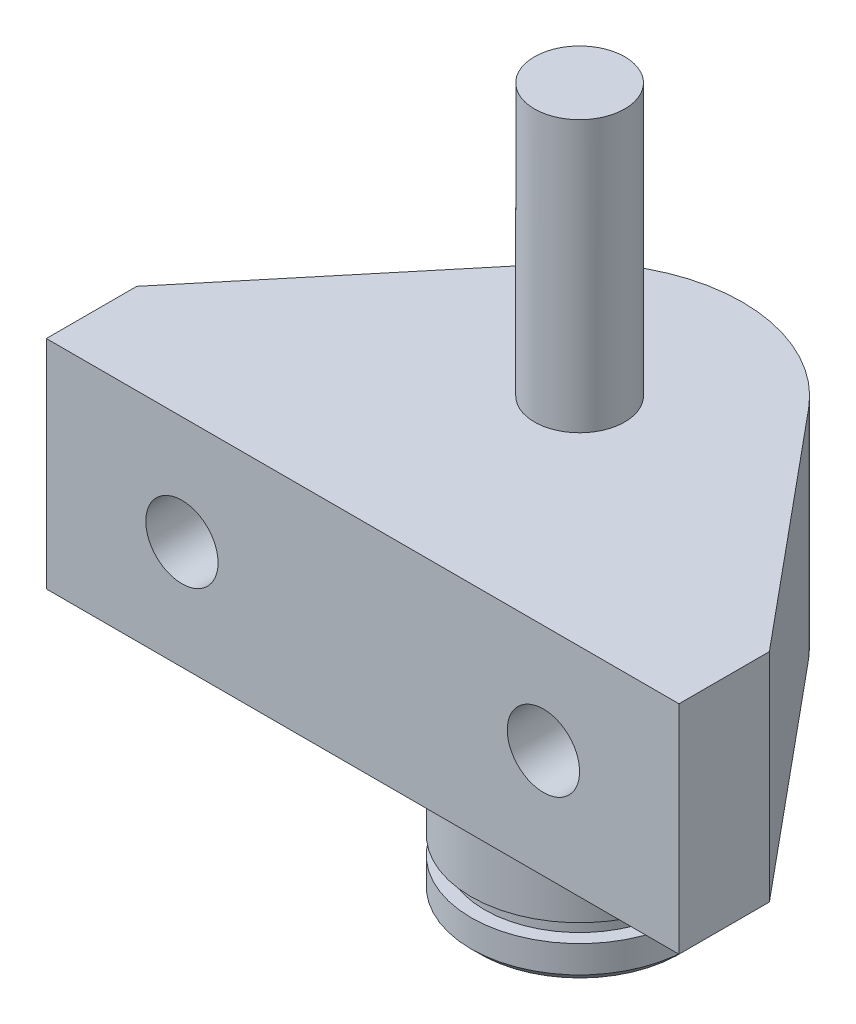
ISO-10303-21;
HEADER;
FILE_DESCRIPTION(('STEP AP214'),'2;1');
FILE_NAME('part.step','',(''),(''),'','','');
FILE_SCHEMA(('AUTOMOTIVE_DESIGN { 1 0 10303 214 1 1 1 1 }'));
ENDSEC;
DATA;
#1=APPLICATION_CONTEXT('core data for automotive mechanical design processes');
#2=APPLICATION_PROTOCOL_DEFINITION('international standard','automotive_design',2000,#1);
#3=PRODUCT_CONTEXT('',#1,'mechanical');
#4=PRODUCT('Part','Part','',(#3));
#5=PRODUCT_RELATED_PRODUCT_CATEGORY('part','',(#4));
#6=PRODUCT_DEFINITION_FORMATION('','',#4);
#7=PRODUCT_DEFINITION_CONTEXT('part definition',#1,'design');
#8=PRODUCT_DEFINITION('design','',#6,#7);
#9=PRODUCT_DEFINITION_SHAPE('','',#8);
#10=(LENGTH_UNIT() NAMED_UNIT(*) SI_UNIT(.MILLI.,.METRE.));
#11=(NAMED_UNIT(*) PLANE_ANGLE_UNIT() SI_UNIT($,.RADIAN.));
#12=(NAMED_UNIT(*) SI_UNIT($,.STERADIAN.) SOLID_ANGLE_UNIT());
#13=UNCERTAINTY_MEASURE_WITH_UNIT(LENGTH_MEASURE(1.E-05),#10,'distance_accuracy_value','');
#14=(GEOMETRIC_REPRESENTATION_CONTEXT(3) GLOBAL_UNCERTAINTY_ASSIGNED_CONTEXT((#13)) GLOBAL_UNIT_ASSIGNED_CONTEXT((#10,
#11,#12)) REPRESENTATION_CONTEXT('',''));
#15=CARTESIAN_POINT('',(0.,0.,0.));
#16=DIRECTION('',(0.,0.,1.));
#17=DIRECTION('',(1.,0.,0.));
#18=AXIS2_PLACEMENT_3D('',#15,#16,#17);
#19=CARTESIAN_POINT('',(-17.5,12.,-6.09769995019883));
#20=DIRECTION('',(1.,0.,0.));
#21=DIRECTION('',(0.,0.,-1.));
#22=AXIS2_PLACEMENT_3D('',#19,#20,#21);
#23=PLANE('',#22);
#24=DIRECTION('',(0.,0.,1.));
#25=VECTOR('',#24,1.);
#26=CARTESIAN_POINT('',(-17.5,0.,-6.09769995019883));
#27=LINE('',#26,#25);
#28=CARTESIAN_POINT('',(-17.5,0.,-6.09769995019883));
#29=VERTEX_POINT('',#28);
#30=CARTESIAN_POINT('',(-17.5,0.,-1.09769995019883));
#31=VERTEX_POINT('',#30);
#32=EDGE_CURVE('E123',#29,#31,#27,.T.);
#33=ORIENTED_EDGE('',*,*,#32,.T.);
#34=DIRECTION('',(0.,-1.,0.));
#35=VECTOR('',#34,1.);
#36=CARTESIAN_POINT('',(-17.5,12.,-1.09769995019883));
#37=LINE('',#36,#35);
#38=CARTESIAN_POINT('',(-17.5,12.,-1.09769995019883));
#39=VERTEX_POINT('',#38);
#40=EDGE_CURVE('E141',#39,#31,#37,.T.);
#41=ORIENTED_EDGE('',*,*,#40,.F.);
#42=DIRECTION('',(0.,0.,1.));
#43=VECTOR('',#42,1.);
#44=CARTESIAN_POINT('',(-17.5,12.,-6.09769995019883));
#45=LINE('',#44,#43);
#46=CARTESIAN_POINT('',(-17.5,12.,-6.09769995019883));
#47=VERTEX_POINT('',#46);
#48=EDGE_CURVE('E134',#47,#39,#45,.T.);
#49=ORIENTED_EDGE('',*,*,#48,.F.);
#50=DIRECTION('',(0.,-1.,0.));
#51=VECTOR('',#50,1.);
#52=CARTESIAN_POINT('',(-17.5,12.,-6.09769995019883));
#53=LINE('',#52,#51);
#54=EDGE_CURVE('E119',#47,#29,#53,.T.);
#55=ORIENTED_EDGE('',*,*,#54,.T.);
#56=EDGE_LOOP('',(#33,#41,#49,#55));
#57=FACE_BOUND('',#56,.T.);
#58=ADVANCED_FACE('F37',(#57),#23,.F.);
#59=CARTESIAN_POINT('',(17.5,12.,-1.09769995019884));
#60=DIRECTION('',(0.,0.,-1.));
#61=DIRECTION('',(-1.,0.,0.));
#62=AXIS2_PLACEMENT_3D('',#59,#60,#61);
#63=PLANE('',#62);
#64=CARTESIAN_POINT('',(10.,6.,-1.09769995019883));
#65=DIRECTION('',(0.,0.,1.));
#66=DIRECTION('',(-1.,0.,0.));
#67=AXIS2_PLACEMENT_3D('',#64,#65,#66);
#68=CIRCLE('',#67,2.);
#69=CARTESIAN_POINT('',(8.,6.,-1.09769995019883));
#70=VERTEX_POINT('',#69);
#71=EDGE_CURVE('E242',#70,#70,#68,.T.);
#72=ORIENTED_EDGE('',*,*,#71,.F.);
#73=EDGE_LOOP('',(#72));
#74=FACE_BOUND('',#73,.T.);
#75=CARTESIAN_POINT('',(-10.,6.,-1.09769995019883));
#76=DIRECTION('',(0.,0.,1.));
#77=DIRECTION('',(1.,0.,0.));
#78=AXIS2_PLACEMENT_3D('',#75,#76,#77);
#79=CIRCLE('',#78,2.);
#80=CARTESIAN_POINT('',(-8.,6.,-1.09769995019883));
#81=VERTEX_POINT('',#80);
#82=EDGE_CURVE('E236',#81,#81,#79,.T.);
#83=ORIENTED_EDGE('',*,*,#82,.F.);
#84=EDGE_LOOP('',(#83));
#85=FACE_BOUND('',#84,.T.);
#86=DIRECTION('',(1.,0.,0.));
#87=VECTOR('',#86,1.);
#88=CARTESIAN_POINT('',(17.5,0.,-1.09769995019884));
#89=LINE('',#88,#87);
#90=CARTESIAN_POINT('',(17.5,0.,-1.09769995019884));
#91=VERTEX_POINT('',#90);
#92=EDGE_CURVE('E126',#31,#91,#89,.T.);
#93=ORIENTED_EDGE('',*,*,#92,.T.);
#94=DIRECTION('',(0.,-1.,0.));
#95=VECTOR('',#94,1.);
#96=CARTESIAN_POINT('',(17.5,12.,-1.09769995019884));
#97=LINE('',#96,#95);
#98=CARTESIAN_POINT('',(17.5,12.,-1.09769995019884));
#99=VERTEX_POINT('',#98);
#100=EDGE_CURVE('E138',#99,#91,#97,.T.);
#101=ORIENTED_EDGE('',*,*,#100,.F.);
#102=DIRECTION('',(1.,0.,0.));
#103=VECTOR('',#102,1.);
#104=CARTESIAN_POINT('',(17.5,12.,-1.09769995019884));
#105=LINE('',#104,#103);
#106=EDGE_CURVE('E92',#39,#99,#105,.T.);
#107=ORIENTED_EDGE('',*,*,#106,.F.);
#108=ORIENTED_EDGE('',*,*,#40,.T.);
#109=EDGE_LOOP('',(#93,#101,#107,#108));
#110=FACE_BOUND('',#109,.T.);
#111=ADVANCED_FACE('F176',(#74,#85,#110),#63,.F.);
#112=CARTESIAN_POINT('',(17.5,12.,-6.09769995019884));
#113=DIRECTION('',(-1.,0.,0.));
#114=DIRECTION('',(0.,0.,1.));
#115=AXIS2_PLACEMENT_3D('',#112,#113,#114);
#116=PLANE('',#115);
#117=DIRECTION('',(0.,0.,-1.));
#118=VECTOR('',#117,1.);
#119=CARTESIAN_POINT('',(17.5,0.,-6.09769995019884));
#120=LINE('',#119,#118);
#121=CARTESIAN_POINT('',(17.5,0.,-6.09769995019884));
#122=VERTEX_POINT('',#121);
#123=EDGE_CURVE('E129',#91,#122,#120,.T.);
#124=ORIENTED_EDGE('',*,*,#123,.T.);
#125=DIRECTION('',(0.,-1.,0.));
#126=VECTOR('',#125,1.);
#127=CARTESIAN_POINT('',(17.5,12.,-6.09769995019884));
#128=LINE('',#127,#126);
#129=CARTESIAN_POINT('',(17.5,12.,-6.09769995019884));
#130=VERTEX_POINT('',#129);
#131=EDGE_CURVE('E114',#130,#122,#128,.T.);
#132=ORIENTED_EDGE('',*,*,#131,.F.);
#133=DIRECTION('',(0.,0.,-1.));
#134=VECTOR('',#133,1.);
#135=CARTESIAN_POINT('',(17.5,12.,-6.09769995019884));
#136=LINE('',#135,#134);
#137=EDGE_CURVE('E105',#99,#130,#136,.T.);
#138=ORIENTED_EDGE('',*,*,#137,.F.);
#139=ORIENTED_EDGE('',*,*,#100,.T.);
#140=EDGE_LOOP('',(#124,#132,#138,#139));
#141=FACE_BOUND('',#140,.T.);
#142=ADVANCED_FACE('F181',(#141),#116,.F.);
#143=CARTESIAN_POINT('',(17.5,12.,-6.09769995019884));
#144=DIRECTION('',(-0.769664929294171,0.,0.638448037521143));
#145=DIRECTION('',(0.638448037521143,0.,0.769664929294171));
#146=AXIS2_PLACEMENT_3D('',#143,#144,#145);
#147=PLANE('',#146);
#148=DIRECTION('',(-0.638448037521143,0.,-0.769664929294171));
#149=VECTOR('',#148,1.);
#150=CARTESIAN_POINT('',(17.5,0.,-6.09769995019884));
#151=LINE('',#150,#149);
#152=CARTESIAN_POINT('',(6.92698436364753,0.,-18.8437322878891));
#153=VERTEX_POINT('',#152);
#154=EDGE_CURVE('E113',#122,#153,#151,.T.);
#155=ORIENTED_EDGE('',*,*,#154,.T.);
#156=DIRECTION('',(0.,-1.,0.));
#157=VECTOR('',#156,1.);
#158=CARTESIAN_POINT('',(6.92698436364753,12.,-18.8437322878891));
#159=LINE('',#158,#157);
#160=CARTESIAN_POINT('',(6.92698436364753,12.,-18.8437322878891));
#161=VERTEX_POINT('',#160);
#162=EDGE_CURVE('E110',#161,#153,#159,.T.);
#163=ORIENTED_EDGE('',*,*,#162,.F.);
#164=DIRECTION('',(-0.638448037521143,0.,-0.769664929294171));
#165=VECTOR('',#164,1.);
#166=CARTESIAN_POINT('',(17.5,12.,-6.09769995019884));
#167=LINE('',#166,#165);
#168=EDGE_CURVE('E99',#130,#161,#167,.T.);
#169=ORIENTED_EDGE('',*,*,#168,.F.);
#170=ORIENTED_EDGE('',*,*,#131,.T.);
#171=EDGE_LOOP('',(#155,#163,#169,#170));
#172=FACE_BOUND('',#171,.T.);
#173=ADVANCED_FACE('F111',(#172),#147,.F.);
#174=CARTESIAN_POINT('',(0.,12.,-13.0976999501988));
#175=DIRECTION('',(0.,-1.,0.));
#176=DIRECTION('',(0.,0.,-1.));
#177=AXIS2_PLACEMENT_3D('',#174,#175,#176);
#178=CYLINDRICAL_SURFACE('',#177,8.99999999999999);
#179=CARTESIAN_POINT('',(0.,0.,-13.0976999501988));
#180=DIRECTION('',(0.,1.,0.));
#181=DIRECTION('',(0.,0.,-1.));
#182=AXIS2_PLACEMENT_3D('',#179,#180,#181);
#183=CIRCLE('',#182,8.99999999999999);
#184=CARTESIAN_POINT('',(-6.92698436364753,0.,-18.8437322878891));
#185=VERTEX_POINT('',#184);
#186=EDGE_CURVE('E77',#153,#185,#183,.T.);
#187=ORIENTED_EDGE('',*,*,#186,.T.);
#188=DIRECTION('',(0.,-1.,0.));
#189=VECTOR('',#188,1.);
#190=CARTESIAN_POINT('',(-6.92698436364753,12.,-18.8437322878891));
#191=LINE('',#190,#189);
#192=CARTESIAN_POINT('',(-6.92698436364753,12.,-18.8437322878891));
#193=VERTEX_POINT('',#192);
#194=EDGE_CURVE('E115',#193,#185,#191,.T.);
#195=ORIENTED_EDGE('',*,*,#194,.F.);
#196=CARTESIAN_POINT('',(0.,12.,-13.0976999501988));
#197=DIRECTION('',(0.,1.,0.));
#198=DIRECTION('',(0.,0.,-1.));
#199=AXIS2_PLACEMENT_3D('',#196,#197,#198);
#200=CIRCLE('',#199,8.99999999999999);
#201=EDGE_CURVE('E103',#161,#193,#200,.T.);
#202=ORIENTED_EDGE('',*,*,#201,.F.);
#203=ORIENTED_EDGE('',*,*,#162,.T.);
#204=EDGE_LOOP('',(#187,#195,#202,#203));
#205=FACE_BOUND('',#204,.T.);
#206=ADVANCED_FACE('F117',(#205),#178,.T.);
#207=CARTESIAN_POINT('',(-17.5,12.,-6.09769995019883));
#208=DIRECTION('',(0.769664929294171,0.,0.638448037521143));
#209=DIRECTION('',(0.638448037521143,0.,-0.769664929294171));
#210=AXIS2_PLACEMENT_3D('',#207,#208,#209);
#211=PLANE('',#210);
#212=DIRECTION('',(-0.638448037521143,0.,0.769664929294171));
#213=VECTOR('',#212,1.);
#214=CARTESIAN_POINT('',(-17.5,0.,-6.09769995019883));
#215=LINE('',#214,#213);
#216=EDGE_CURVE('E83',#185,#29,#215,.T.);
#217=ORIENTED_EDGE('',*,*,#216,.T.);
#218=ORIENTED_EDGE('',*,*,#54,.F.);
#219=DIRECTION('',(-0.638448037521143,0.,0.769664929294171));
#220=VECTOR('',#219,1.);
#221=CARTESIAN_POINT('',(-17.5,12.,-6.09769995019883));
#222=LINE('',#221,#220);
#223=EDGE_CURVE('E54',#193,#47,#222,.T.);
#224=ORIENTED_EDGE('',*,*,#223,.F.);
#225=ORIENTED_EDGE('',*,*,#194,.T.);
#226=EDGE_LOOP('',(#217,#218,#224,#225));
#227=FACE_BOUND('',#226,.T.);
#228=ADVANCED_FACE('F192',(#227),#211,.F.);
#229=CARTESIAN_POINT('',(0.,12.,-13.0976999501988));
#230=DIRECTION('',(0.,-1.,0.));
#231=DIRECTION('',(0.,0.,-1.));
#232=AXIS2_PLACEMENT_3D('',#229,#230,#231);
#233=PLANE('',#232);
#234=CARTESIAN_POINT('',(0.,12.,-13.0976999501988));
#235=DIRECTION('',(0.,-1.,0.));
#236=DIRECTION('',(0.,0.,-1.));
#237=AXIS2_PLACEMENT_3D('',#234,#235,#236);
#238=CIRCLE('',#237,2.5);
#239=CARTESIAN_POINT('',(0.,12.,-15.5976999501988));
#240=VERTEX_POINT('',#239);
#241=EDGE_CURVE('E11',#240,#240,#238,.F.);
#242=ORIENTED_EDGE('',*,*,#241,.F.);
#243=EDGE_LOOP('',(#242));
#244=FACE_BOUND('',#243,.T.);
#245=ORIENTED_EDGE('',*,*,#48,.T.);
#246=ORIENTED_EDGE('',*,*,#106,.T.);
#247=ORIENTED_EDGE('',*,*,#137,.T.);
#248=ORIENTED_EDGE('',*,*,#168,.T.);
#249=ORIENTED_EDGE('',*,*,#201,.T.);
#250=ORIENTED_EDGE('',*,*,#223,.T.);
#251=EDGE_LOOP('',(#245,#246,#247,#248,#249,#250));
#252=FACE_BOUND('',#251,.T.);
#253=ADVANCED_FACE('F101',(#244,#252),#233,.F.);
#254=CARTESIAN_POINT('',(0.,0.,-13.0976999501988));
#255=DIRECTION('',(0.,-1.,0.));
#256=DIRECTION('',(0.,0.,-1.));
#257=AXIS2_PLACEMENT_3D('',#254,#255,#256);
#258=PLANE('',#257);
#259=CARTESIAN_POINT('',(0.,0.,-13.0976999501988));
#260=DIRECTION('',(0.,-1.,0.));
#261=DIRECTION('',(0.,0.,-1.));
#262=AXIS2_PLACEMENT_3D('',#259,#260,#261);
#263=CIRCLE('',#262,6.);
#264=CARTESIAN_POINT('',(0.,0.,-19.0976999501988));
#265=VERTEX_POINT('',#264);
#266=EDGE_CURVE('E143',#265,#265,#263,.T.);
#267=ORIENTED_EDGE('',*,*,#266,.F.);
#268=EDGE_LOOP('',(#267));
#269=FACE_BOUND('',#268,.T.);
#270=ORIENTED_EDGE('',*,*,#32,.F.);
#271=ORIENTED_EDGE('',*,*,#216,.F.);
#272=ORIENTED_EDGE('',*,*,#186,.F.);
#273=ORIENTED_EDGE('',*,*,#154,.F.);
#274=ORIENTED_EDGE('',*,*,#123,.F.);
#275=ORIENTED_EDGE('',*,*,#92,.F.);
#276=EDGE_LOOP('',(#270,#271,#272,#273,#274,#275));
#277=FACE_BOUND('',#276,.T.);
#278=ADVANCED_FACE('F195',(#269,#277),#258,.T.);
#279=CARTESIAN_POINT('',(0.,-9.,-13.0976999501988));
#280=DIRECTION('',(0.,1.,0.));
#281=DIRECTION('',(0.,0.,1.));
#282=AXIS2_PLACEMENT_3D('',#279,#280,#281);
#283=CYLINDRICAL_SURFACE('',#282,6.);
#284=CARTESIAN_POINT('',(0.,-9.,-13.0976999501988));
#285=DIRECTION('',(0.,1.,0.));
#286=DIRECTION('',(0.,0.,1.));
#287=AXIS2_PLACEMENT_3D('',#284,#285,#286);
#288=CIRCLE('',#287,6.);
#289=CARTESIAN_POINT('',(0.,-9.,-7.09769995019883));
#290=VERTEX_POINT('',#289);
#291=EDGE_CURVE('E127',#290,#290,#288,.T.);
#292=ORIENTED_EDGE('',*,*,#291,.T.);
#293=EDGE_LOOP('',(#292));
#294=FACE_BOUND('',#293,.T.);
#295=ORIENTED_EDGE('',*,*,#266,.T.);
#296=EDGE_LOOP('',(#295));
#297=FACE_BOUND('',#296,.T.);
#298=ADVANCED_FACE('F198',(#294,#297),#283,.T.);
#299=CARTESIAN_POINT('',(0.,-9.,-13.0976999501988));
#300=DIRECTION('',(0.,1.,0.));
#301=DIRECTION('',(0.,0.,1.));
#302=AXIS2_PLACEMENT_3D('',#299,#300,#301);
#303=PLANE('',#302);
#304=CARTESIAN_POINT('',(0.,-9.,-13.0976999501988));
#305=DIRECTION('',(0.,1.,0.));
#306=DIRECTION('',(0.,0.,1.));
#307=AXIS2_PLACEMENT_3D('',#304,#305,#306);
#308=CIRCLE('',#307,5.25);
#309=CARTESIAN_POINT('',(0.,-9.,-7.84769995019883));
#310=VERTEX_POINT('',#309);
#311=EDGE_CURVE('E146',#310,#310,#308,.F.);
#312=ORIENTED_EDGE('',*,*,#311,.F.);
#313=EDGE_LOOP('',(#312));
#314=FACE_BOUND('',#313,.T.);
#315=ORIENTED_EDGE('',*,*,#291,.F.);
#316=EDGE_LOOP('',(#315));
#317=FACE_BOUND('',#316,.T.);
#318=ADVANCED_FACE('F205',(#314,#317),#303,.F.);
#319=CARTESIAN_POINT('',(0.,-10.,-13.0976999501988));
#320=DIRECTION('',(0.,1.,0.));
#321=DIRECTION('',(0.,0.,1.));
#322=AXIS2_PLACEMENT_3D('',#319,#320,#321);
#323=CYLINDRICAL_SURFACE('',#322,5.25);
#324=CARTESIAN_POINT('',(0.,-10.,-13.0976999501988));
#325=DIRECTION('',(0.,-1.,0.));
#326=DIRECTION('',(0.,0.,-1.));
#327=AXIS2_PLACEMENT_3D('',#324,#325,#326);
#328=CIRCLE('',#327,5.25);
#329=CARTESIAN_POINT('',(0.,-10.,-18.3476999501988));
#330=VERTEX_POINT('',#329);
#331=EDGE_CURVE('E217',#330,#330,#328,.T.);
#332=ORIENTED_EDGE('',*,*,#331,.F.);
#333=EDGE_LOOP('',(#332));
#334=FACE_BOUND('',#333,.T.);
#335=ORIENTED_EDGE('',*,*,#311,.T.);
#336=EDGE_LOOP('',(#335));
#337=FACE_BOUND('',#336,.T.);
#338=ADVANCED_FACE('F172',(#334,#337),#323,.T.);
#339=CARTESIAN_POINT('',(0.,-12.,-13.0976999501988));
#340=DIRECTION('',(0.,1.,0.));
#341=DIRECTION('',(0.,0.,1.));
#342=AXIS2_PLACEMENT_3D('',#339,#340,#341);
#343=CYLINDRICAL_SURFACE('',#342,6.);
#344=CARTESIAN_POINT('',(0.,-11.5,-13.0976999501988));
#345=DIRECTION('',(0.,-1.,0.));
#346=DIRECTION('',(0.,0.,-1.));
#347=AXIS2_PLACEMENT_3D('',#344,#345,#346);
#348=CIRCLE('',#347,6.);
#349=CARTESIAN_POINT('',(0.,-11.5,-19.0976999501988));
#350=VERTEX_POINT('',#349);
#351=EDGE_CURVE('E46',#350,#350,#348,.F.);
#352=ORIENTED_EDGE('',*,*,#351,.T.);
#353=EDGE_LOOP('',(#352));
#354=FACE_BOUND('',#353,.T.);
#355=CARTESIAN_POINT('',(0.,-10.,-13.0976999501988));
#356=DIRECTION('',(0.,-1.,0.));
#357=DIRECTION('',(0.,0.,-1.));
#358=AXIS2_PLACEMENT_3D('',#355,#356,#357);
#359=CIRCLE('',#358,6.);
#360=CARTESIAN_POINT('',(0.,-10.,-19.0976999501988));
#361=VERTEX_POINT('',#360);
#362=EDGE_CURVE('E223',#361,#361,#359,.T.);
#363=ORIENTED_EDGE('',*,*,#362,.T.);
#364=EDGE_LOOP('',(#363));
#365=FACE_BOUND('',#364,.T.);
#366=ADVANCED_FACE('F154',(#354,#365),#343,.T.);
#367=CARTESIAN_POINT('',(0.,-12.,-13.0976999501988));
#368=DIRECTION('',(0.,-1.,0.));
#369=DIRECTION('',(0.,0.,-1.));
#370=AXIS2_PLACEMENT_3D('',#367,#368,#369);
#371=PLANE('',#370);
#372=CARTESIAN_POINT('',(0.,-12.,-13.0976999501988));
#373=DIRECTION('',(0.,-1.,0.));
#374=DIRECTION('',(0.,0.,-1.));
#375=AXIS2_PLACEMENT_3D('',#372,#373,#374);
#376=CIRCLE('',#375,5.5);
#377=CARTESIAN_POINT('',(0.,-12.,-18.5976999501988));
#378=VERTEX_POINT('',#377);
#379=EDGE_CURVE('E149',#378,#378,#376,.T.);
#380=ORIENTED_EDGE('',*,*,#379,.T.);
#381=EDGE_LOOP('',(#380));
#382=FACE_BOUND('',#381,.T.);
#383=ADVANCED_FACE('F163',(#382),#371,.T.);
#384=CARTESIAN_POINT('',(0.,-10.,-13.0976999501988));
#385=DIRECTION('',(0.,-1.,0.));
#386=DIRECTION('',(0.,0.,-1.));
#387=AXIS2_PLACEMENT_3D('',#384,#385,#386);
#388=PLANE('',#387);
#389=ORIENTED_EDGE('',*,*,#331,.T.);
#390=EDGE_LOOP('',(#389));
#391=FACE_BOUND('',#390,.T.);
#392=ORIENTED_EDGE('',*,*,#362,.F.);
#393=EDGE_LOOP('',(#392));
#394=FACE_BOUND('',#393,.T.);
#395=ADVANCED_FACE('F160',(#391,#394),#388,.F.);
#396=CARTESIAN_POINT('',(0.,-12.,-13.0976999501988));
#397=DIRECTION('',(0.,1.,0.));
#398=DIRECTION('',(0.,0.,1.));
#399=AXIS2_PLACEMENT_3D('',#396,#397,#398);
#400=CONICAL_SURFACE('',#399,5.5,0.785398163397447);
#401=ORIENTED_EDGE('',*,*,#351,.F.);
#402=EDGE_LOOP('',(#401));
#403=FACE_BOUND('',#402,.T.);
#404=ORIENTED_EDGE('',*,*,#379,.F.);
#405=EDGE_LOOP('',(#404));
#406=FACE_BOUND('',#405,.T.);
#407=ADVANCED_FACE('F39',(#403,#406),#400,.T.);
#408=CARTESIAN_POINT('',(-10.,6.,-6.09769995019883));
#409=DIRECTION('',(0.,0.,1.));
#410=DIRECTION('',(1.,0.,0.));
#411=AXIS2_PLACEMENT_3D('',#408,#409,#410);
#412=CYLINDRICAL_SURFACE('',#411,2.);
#413=CARTESIAN_POINT('',(-10.,6.,-6.09769995019883));
#414=DIRECTION('',(0.,0.,1.));
#415=DIRECTION('',(1.,0.,0.));
#416=AXIS2_PLACEMENT_3D('',#413,#414,#415);
#417=CIRCLE('',#416,2.);
#418=CARTESIAN_POINT('',(-8.,6.,-6.09769995019883));
#419=VERTEX_POINT('',#418);
#420=EDGE_CURVE('E235',#419,#419,#417,.T.);
#421=ORIENTED_EDGE('',*,*,#420,.F.);
#422=EDGE_LOOP('',(#421));
#423=FACE_BOUND('',#422,.T.);
#424=ORIENTED_EDGE('',*,*,#82,.T.);
#425=EDGE_LOOP('',(#424));
#426=FACE_BOUND('',#425,.T.);
#427=ADVANCED_FACE('F159',(#423,#426),#412,.F.);
#428=CARTESIAN_POINT('',(-10.,6.,-6.09769995019883));
#429=DIRECTION('',(0.,0.,1.));
#430=DIRECTION('',(1.,0.,0.));
#431=AXIS2_PLACEMENT_3D('',#428,#429,#430);
#432=PLANE('',#431);
#433=ORIENTED_EDGE('',*,*,#420,.T.);
#434=EDGE_LOOP('',(#433));
#435=FACE_BOUND('',#434,.T.);
#436=ADVANCED_FACE('F270',(#435),#432,.T.);
#437=CARTESIAN_POINT('',(10.,6.,-6.09769995019883));
#438=DIRECTION('',(0.,0.,1.));
#439=DIRECTION('',(1.,0.,0.));
#440=AXIS2_PLACEMENT_3D('',#437,#438,#439);
#441=CYLINDRICAL_SURFACE('',#440,2.);
#442=CARTESIAN_POINT('',(10.,6.,-6.09769995019883));
#443=DIRECTION('',(0.,0.,1.));
#444=DIRECTION('',(-1.,0.,0.));
#445=AXIS2_PLACEMENT_3D('',#442,#443,#444);
#446=CIRCLE('',#445,2.);
#447=CARTESIAN_POINT('',(8.,6.,-6.09769995019883));
#448=VERTEX_POINT('',#447);
#449=EDGE_CURVE('E239',#448,#448,#446,.T.);
#450=ORIENTED_EDGE('',*,*,#449,.F.);
#451=EDGE_LOOP('',(#450));
#452=FACE_BOUND('',#451,.T.);
#453=ORIENTED_EDGE('',*,*,#71,.T.);
#454=EDGE_LOOP('',(#453));
#455=FACE_BOUND('',#454,.T.);
#456=ADVANCED_FACE('F264',(#452,#455),#441,.F.);
#457=CARTESIAN_POINT('',(10.,6.,-6.09769995019883));
#458=DIRECTION('',(0.,0.,-1.));
#459=DIRECTION('',(-1.,0.,0.));
#460=AXIS2_PLACEMENT_3D('',#457,#458,#459);
#461=PLANE('',#460);
#462=ORIENTED_EDGE('',*,*,#449,.T.);
#463=EDGE_LOOP('',(#462));
#464=FACE_BOUND('',#463,.T.);
#465=ADVANCED_FACE('F256',(#464),#461,.F.);
#466=CARTESIAN_POINT('',(0.,27.,-13.0976999501988));
#467=DIRECTION('',(0.,-1.,0.));
#468=DIRECTION('',(0.,0.,-1.));
#469=AXIS2_PLACEMENT_3D('',#466,#467,#468);
#470=CYLINDRICAL_SURFACE('',#469,2.5);
#471=CARTESIAN_POINT('',(0.,27.,-13.0976999501988));
#472=DIRECTION('',(0.,1.,0.));
#473=DIRECTION('',(0.,0.,1.));
#474=AXIS2_PLACEMENT_3D('',#471,#472,#473);
#475=CIRCLE('',#474,2.5);
#476=CARTESIAN_POINT('',(0.,27.,-10.5976999501988));
#477=VERTEX_POINT('',#476);
#478=EDGE_CURVE('E245',#477,#477,#475,.T.);
#479=ORIENTED_EDGE('',*,*,#478,.F.);
#480=EDGE_LOOP('',(#479));
#481=FACE_BOUND('',#480,.T.);
#482=ORIENTED_EDGE('',*,*,#241,.T.);
#483=EDGE_LOOP('',(#482));
#484=FACE_BOUND('',#483,.T.);
#485=ADVANCED_FACE('F253',(#481,#484),#470,.T.);
#486=CARTESIAN_POINT('',(0.,27.,-13.0976999501988));
#487=DIRECTION('',(0.,1.,0.));
#488=DIRECTION('',(0.,0.,1.));
#489=AXIS2_PLACEMENT_3D('',#486,#487,#488);
#490=PLANE('',#489);
#491=ORIENTED_EDGE('',*,*,#478,.T.);
#492=EDGE_LOOP('',(#491));
#493=FACE_BOUND('',#492,.T.);
#494=ADVANCED_FACE('F251',(#493),#490,.T.);
#495=CLOSED_SHELL('',(#58,#111,#142,#173,#206,#228,#253,#278,#298,#318,#338,#366,#383,#395,#407,
#427,#436,#456,#465,#485,#494));
#496=MANIFOLD_SOLID_BREP('B2',#495);
#497=ADVANCED_BREP_SHAPE_REPRESENTATION('',(#18,#496),#14);
#498=SHAPE_DEFINITION_REPRESENTATION(#9,#497);
ENDSEC;
END-ISO-10303-21;
